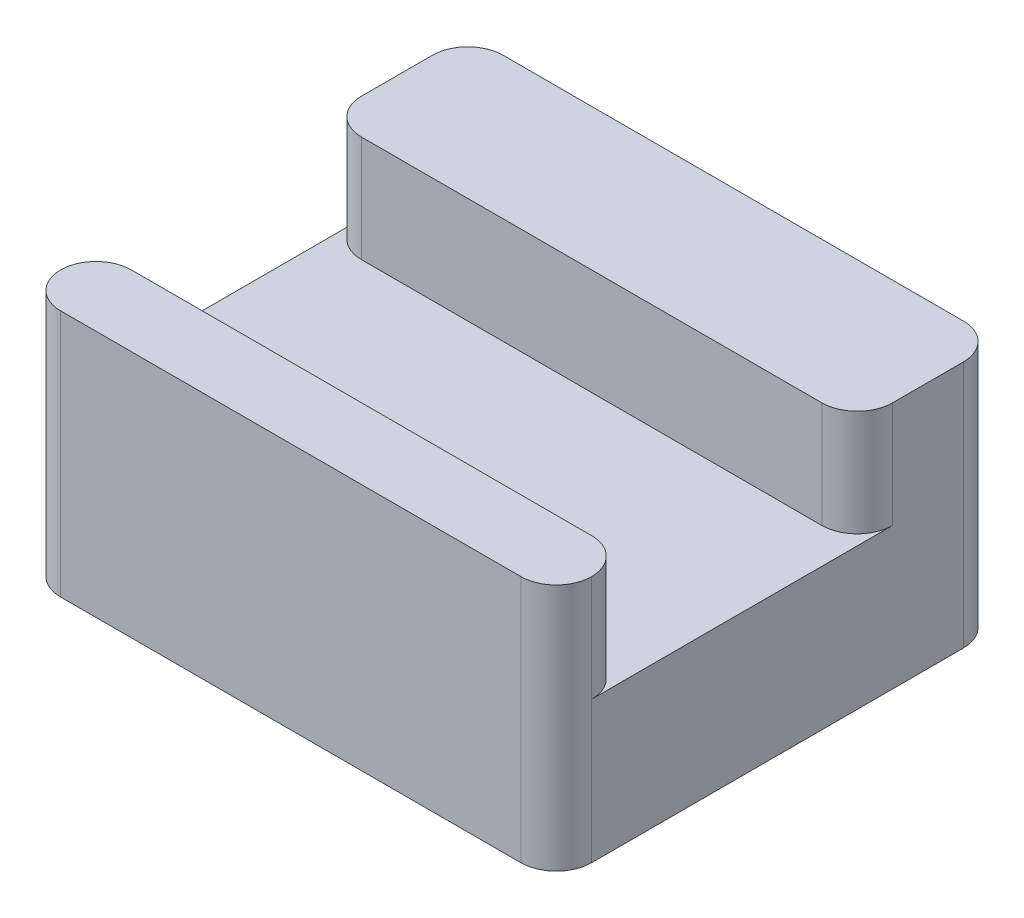
ISO-10303-21;
HEADER;
FILE_DESCRIPTION(('STEP AP214'),'2;1');
FILE_NAME('part.step','',(''),(''),'','','');
FILE_SCHEMA(('AUTOMOTIVE_DESIGN { 1 0 10303 214 1 1 1 1 }'));
ENDSEC;
DATA;
#1=APPLICATION_CONTEXT('core data for automotive mechanical design processes');
#2=APPLICATION_PROTOCOL_DEFINITION('international standard','automotive_design',2000,#1);
#3=PRODUCT_CONTEXT('',#1,'mechanical');
#4=PRODUCT('Part','Part','',(#3));
#5=PRODUCT_RELATED_PRODUCT_CATEGORY('part','',(#4));
#6=PRODUCT_DEFINITION_FORMATION('','',#4);
#7=PRODUCT_DEFINITION_CONTEXT('part definition',#1,'design');
#8=PRODUCT_DEFINITION('design','',#6,#7);
#9=PRODUCT_DEFINITION_SHAPE('','',#8);
#10=(LENGTH_UNIT() NAMED_UNIT(*) SI_UNIT(.MILLI.,.METRE.));
#11=(NAMED_UNIT(*) PLANE_ANGLE_UNIT() SI_UNIT($,.RADIAN.));
#12=(NAMED_UNIT(*) SI_UNIT($,.STERADIAN.) SOLID_ANGLE_UNIT());
#13=UNCERTAINTY_MEASURE_WITH_UNIT(LENGTH_MEASURE(1.E-05),#10,'distance_accuracy_value','');
#14=(GEOMETRIC_REPRESENTATION_CONTEXT(3) GLOBAL_UNCERTAINTY_ASSIGNED_CONTEXT((#13)) GLOBAL_UNIT_ASSIGNED_CONTEXT((#10,
#11,#12)) REPRESENTATION_CONTEXT('',''));
#15=CARTESIAN_POINT('',(0.,0.,0.));
#16=DIRECTION('',(0.,0.,1.));
#17=DIRECTION('',(1.,0.,0.));
#18=AXIS2_PLACEMENT_3D('',#15,#16,#17);
#19=CARTESIAN_POINT('',(0.,7.,0.));
#20=DIRECTION('',(0.,-1.,0.));
#21=DIRECTION('',(0.,0.,-1.));
#22=AXIS2_PLACEMENT_3D('',#19,#20,#21);
#23=PLANE('',#22);
#24=CARTESIAN_POINT('',(-6.5,7.,5.25));
#25=DIRECTION('',(0.,-1.,0.));
#26=DIRECTION('',(0.,0.,-1.));
#27=AXIS2_PLACEMENT_3D('',#24,#25,#26);
#28=CIRCLE('',#27,1.);
#29=CARTESIAN_POINT('',(-6.5,7.,4.25));
#30=VERTEX_POINT('',#29);
#31=CARTESIAN_POINT('',(-7.5,7.,5.25));
#32=VERTEX_POINT('',#31);
#33=EDGE_CURVE('E196',#30,#32,#28,.F.);
#34=ORIENTED_EDGE('',*,*,#33,.T.);
#35=CARTESIAN_POINT('',(-6.5,7.,5.25));
#36=DIRECTION('',(0.,-1.,0.));
#37=DIRECTION('',(0.,0.,-1.));
#38=AXIS2_PLACEMENT_3D('',#35,#36,#37);
#39=CIRCLE('',#38,1.);
#40=CARTESIAN_POINT('',(-6.5,7.,6.25));
#41=VERTEX_POINT('',#40);
#42=EDGE_CURVE('E198',#32,#41,#39,.F.);
#43=ORIENTED_EDGE('',*,*,#42,.T.);
#44=DIRECTION('',(1.,0.,0.));
#45=VECTOR('',#44,1.);
#46=CARTESIAN_POINT('',(-7.5,7.,6.25));
#47=LINE('',#46,#45);
#48=CARTESIAN_POINT('',(6.5,7.,6.25));
#49=VERTEX_POINT('',#48);
#50=EDGE_CURVE('E164',#41,#49,#47,.T.);
#51=ORIENTED_EDGE('',*,*,#50,.T.);
#52=CARTESIAN_POINT('',(6.5,7.,5.25));
#53=DIRECTION('',(0.,-1.,0.));
#54=DIRECTION('',(0.,0.,-1.));
#55=AXIS2_PLACEMENT_3D('',#52,#53,#54);
#56=CIRCLE('',#55,1.);
#57=CARTESIAN_POINT('',(7.5,7.,5.25));
#58=VERTEX_POINT('',#57);
#59=EDGE_CURVE('E192',#49,#58,#56,.F.);
#60=ORIENTED_EDGE('',*,*,#59,.T.);
#61=CARTESIAN_POINT('',(6.5,7.,5.25));
#62=DIRECTION('',(0.,-1.,0.));
#63=DIRECTION('',(0.,0.,-1.));
#64=AXIS2_PLACEMENT_3D('',#61,#62,#63);
#65=CIRCLE('',#64,1.);
#66=CARTESIAN_POINT('',(6.5,7.,4.25));
#67=VERTEX_POINT('',#66);
#68=EDGE_CURVE('E194',#58,#67,#65,.F.);
#69=ORIENTED_EDGE('',*,*,#68,.T.);
#70=DIRECTION('',(1.,0.,0.));
#71=VECTOR('',#70,1.);
#72=CARTESIAN_POINT('',(-7.5,7.,4.25));
#73=LINE('',#72,#71);
#74=EDGE_CURVE('E267',#30,#67,#73,.T.);
#75=ORIENTED_EDGE('',*,*,#74,.F.);
#76=EDGE_LOOP('',(#34,#43,#51,#60,#69,#75));
#77=FACE_BOUND('',#76,.T.);
#78=ADVANCED_FACE('F37',(#77),#23,.F.);
#79=CARTESIAN_POINT('',(7.5,7.,6.25));
#80=DIRECTION('',(-1.,0.,0.));
#81=DIRECTION('',(0.,0.,1.));
#82=AXIS2_PLACEMENT_3D('',#79,#80,#81);
#83=PLANE('',#82);
#84=DIRECTION('',(0.,0.,-1.));
#85=VECTOR('',#84,1.);
#86=CARTESIAN_POINT('',(7.5,0.,6.25));
#87=LINE('',#86,#85);
#88=CARTESIAN_POINT('',(7.5,0.,5.25));
#89=VERTEX_POINT('',#88);
#90=CARTESIAN_POINT('',(7.5,0.,-5.25));
#91=VERTEX_POINT('',#90);
#92=EDGE_CURVE('E251',#89,#91,#87,.T.);
#93=ORIENTED_EDGE('',*,*,#92,.T.);
#94=DIRECTION('',(0.,-1.,0.));
#95=VECTOR('',#94,1.);
#96=CARTESIAN_POINT('',(7.5,7.,-5.25));
#97=LINE('',#96,#95);
#98=CARTESIAN_POINT('',(7.5,7.,-5.25));
#99=VERTEX_POINT('',#98);
#100=EDGE_CURVE('E227',#91,#99,#97,.F.);
#101=ORIENTED_EDGE('',*,*,#100,.T.);
#102=DIRECTION('',(0.,0.,-1.));
#103=VECTOR('',#102,1.);
#104=CARTESIAN_POINT('',(7.5,7.,6.25));
#105=LINE('',#104,#103);
#106=CARTESIAN_POINT('',(7.5,7.,-3.25));
#107=VERTEX_POINT('',#106);
#108=EDGE_CURVE('E171',#107,#99,#105,.T.);
#109=ORIENTED_EDGE('',*,*,#108,.F.);
#110=DIRECTION('',(0.,1.,0.));
#111=VECTOR('',#110,1.);
#112=CARTESIAN_POINT('',(7.5,7.,-3.25));
#113=LINE('',#112,#111);
#114=CARTESIAN_POINT('',(7.5,4.,-3.25));
#115=VERTEX_POINT('',#114);
#116=EDGE_CURVE('E225',#107,#115,#113,.F.);
#117=ORIENTED_EDGE('',*,*,#116,.T.);
#118=DIRECTION('',(0.,0.,-1.));
#119=VECTOR('',#118,1.);
#120=CARTESIAN_POINT('',(7.5,4.,4.25));
#121=LINE('',#120,#119);
#122=CARTESIAN_POINT('',(7.5,4.,5.25));
#123=VERTEX_POINT('',#122);
#124=EDGE_CURVE('E53',#123,#115,#121,.T.);
#125=ORIENTED_EDGE('',*,*,#124,.F.);
#126=DIRECTION('',(0.,-1.,0.));
#127=VECTOR('',#126,1.);
#128=CARTESIAN_POINT('',(7.5,7.,5.25));
#129=LINE('',#128,#127);
#130=EDGE_CURVE('E223',#123,#89,#129,.T.);
#131=ORIENTED_EDGE('',*,*,#130,.T.);
#132=EDGE_LOOP('',(#93,#101,#109,#117,#125,#131));
#133=FACE_BOUND('',#132,.T.);
#134=ADVANCED_FACE('F250',(#133),#83,.F.);
#135=CARTESIAN_POINT('',(-7.5,7.,-6.25));
#136=DIRECTION('',(0.,0.,1.));
#137=DIRECTION('',(1.,0.,0.));
#138=AXIS2_PLACEMENT_3D('',#135,#136,#137);
#139=PLANE('',#138);
#140=CARTESIAN_POINT('',(0.,2.,-6.25));
#141=DIRECTION('',(0.,0.,-1.));
#142=DIRECTION('',(-1.,0.,0.));
#143=AXIS2_PLACEMENT_3D('',#140,#141,#142);
#144=CIRCLE('',#143,1.3);
#145=CARTESIAN_POINT('',(-1.3,2.,-6.25));
#146=VERTEX_POINT('',#145);
#147=EDGE_CURVE('E235',#146,#146,#144,.T.);
#148=ORIENTED_EDGE('',*,*,#147,.F.);
#149=EDGE_LOOP('',(#148));
#150=FACE_BOUND('',#149,.T.);
#151=DIRECTION('',(-1.,0.,0.));
#152=VECTOR('',#151,1.);
#153=CARTESIAN_POINT('',(-7.5,0.,-6.25));
#154=LINE('',#153,#152);
#155=CARTESIAN_POINT('',(6.5,0.,-6.25));
#156=VERTEX_POINT('',#155);
#157=CARTESIAN_POINT('',(-6.5,0.,-6.25));
#158=VERTEX_POINT('',#157);
#159=EDGE_CURVE('E177',#156,#158,#154,.T.);
#160=ORIENTED_EDGE('',*,*,#159,.T.);
#161=DIRECTION('',(0.,-1.,0.));
#162=VECTOR('',#161,1.);
#163=CARTESIAN_POINT('',(-6.5,7.,-6.25));
#164=LINE('',#163,#162);
#165=CARTESIAN_POINT('',(-6.5,7.,-6.25));
#166=VERTEX_POINT('',#165);
#167=EDGE_CURVE('E221',#158,#166,#164,.F.);
#168=ORIENTED_EDGE('',*,*,#167,.T.);
#169=DIRECTION('',(-1.,0.,0.));
#170=VECTOR('',#169,1.);
#171=CARTESIAN_POINT('',(-7.5,7.,-6.25));
#172=LINE('',#171,#170);
#173=CARTESIAN_POINT('',(6.5,7.,-6.25));
#174=VERTEX_POINT('',#173);
#175=EDGE_CURVE('E175',#174,#166,#172,.T.);
#176=ORIENTED_EDGE('',*,*,#175,.F.);
#177=DIRECTION('',(0.,-1.,0.));
#178=VECTOR('',#177,1.);
#179=CARTESIAN_POINT('',(6.5,7.,-6.25));
#180=LINE('',#179,#178);
#181=EDGE_CURVE('E218',#174,#156,#180,.T.);
#182=ORIENTED_EDGE('',*,*,#181,.T.);
#183=EDGE_LOOP('',(#160,#168,#176,#182));
#184=FACE_BOUND('',#183,.T.);
#185=ADVANCED_FACE('F290',(#150,#184),#139,.F.);
#186=CARTESIAN_POINT('',(-7.5,7.,6.25));
#187=DIRECTION('',(1.,0.,0.));
#188=DIRECTION('',(0.,0.,-1.));
#189=AXIS2_PLACEMENT_3D('',#186,#187,#188);
#190=PLANE('',#189);
#191=DIRECTION('',(0.,0.,1.));
#192=VECTOR('',#191,1.);
#193=CARTESIAN_POINT('',(-7.5,0.,6.25));
#194=LINE('',#193,#192);
#195=CARTESIAN_POINT('',(-7.5,0.,-5.25));
#196=VERTEX_POINT('',#195);
#197=CARTESIAN_POINT('',(-7.5,0.,5.25));
#198=VERTEX_POINT('',#197);
#199=EDGE_CURVE('E172',#196,#198,#194,.T.);
#200=ORIENTED_EDGE('',*,*,#199,.T.);
#201=DIRECTION('',(0.,-1.,0.));
#202=VECTOR('',#201,1.);
#203=CARTESIAN_POINT('',(-7.5,7.,5.25));
#204=LINE('',#203,#202);
#205=CARTESIAN_POINT('',(-7.5,4.,5.25));
#206=VERTEX_POINT('',#205);
#207=EDGE_CURVE('E149',#198,#206,#204,.F.);
#208=ORIENTED_EDGE('',*,*,#207,.T.);
#209=DIRECTION('',(0.,0.,1.));
#210=VECTOR('',#209,1.);
#211=CARTESIAN_POINT('',(-7.5,4.,4.25));
#212=LINE('',#211,#210);
#213=CARTESIAN_POINT('',(-7.5,4.,-3.25));
#214=VERTEX_POINT('',#213);
#215=EDGE_CURVE('E258',#214,#206,#212,.T.);
#216=ORIENTED_EDGE('',*,*,#215,.F.);
#217=DIRECTION('',(0.,1.,0.));
#218=VECTOR('',#217,1.);
#219=CARTESIAN_POINT('',(-7.5,7.,-3.25));
#220=LINE('',#219,#218);
#221=CARTESIAN_POINT('',(-7.5,7.,-3.25));
#222=VERTEX_POINT('',#221);
#223=EDGE_CURVE('E188',#214,#222,#220,.T.);
#224=ORIENTED_EDGE('',*,*,#223,.T.);
#225=DIRECTION('',(0.,0.,1.));
#226=VECTOR('',#225,1.);
#227=CARTESIAN_POINT('',(-7.5,7.,6.25));
#228=LINE('',#227,#226);
#229=CARTESIAN_POINT('',(-7.5,7.,-5.25));
#230=VERTEX_POINT('',#229);
#231=EDGE_CURVE('E262',#230,#222,#228,.T.);
#232=ORIENTED_EDGE('',*,*,#231,.F.);
#233=DIRECTION('',(0.,-1.,0.));
#234=VECTOR('',#233,1.);
#235=CARTESIAN_POINT('',(-7.5,7.,-5.25));
#236=LINE('',#235,#234);
#237=EDGE_CURVE('E154',#230,#196,#236,.T.);
#238=ORIENTED_EDGE('',*,*,#237,.T.);
#239=EDGE_LOOP('',(#200,#208,#216,#224,#232,#238));
#240=FACE_BOUND('',#239,.T.);
#241=ADVANCED_FACE('F293',(#240),#190,.F.);
#242=CARTESIAN_POINT('',(-7.5,7.,6.25));
#243=DIRECTION('',(0.,0.,-1.));
#244=DIRECTION('',(-1.,0.,0.));
#245=AXIS2_PLACEMENT_3D('',#242,#243,#244);
#246=PLANE('',#245);
#247=ORIENTED_EDGE('',*,*,#50,.F.);
#248=DIRECTION('',(0.,-1.,0.));
#249=VECTOR('',#248,1.);
#250=CARTESIAN_POINT('',(-6.5,7.,6.25));
#251=LINE('',#250,#249);
#252=CARTESIAN_POINT('',(-6.5,0.,6.25));
#253=VERTEX_POINT('',#252);
#254=EDGE_CURVE('E147',#41,#253,#251,.T.);
#255=ORIENTED_EDGE('',*,*,#254,.T.);
#256=DIRECTION('',(1.,0.,0.));
#257=VECTOR('',#256,1.);
#258=CARTESIAN_POINT('',(-7.5,0.,6.25));
#259=LINE('',#258,#257);
#260=CARTESIAN_POINT('',(6.5,0.,6.25));
#261=VERTEX_POINT('',#260);
#262=EDGE_CURVE('E161',#253,#261,#259,.T.);
#263=ORIENTED_EDGE('',*,*,#262,.T.);
#264=DIRECTION('',(0.,-1.,0.));
#265=VECTOR('',#264,1.);
#266=CARTESIAN_POINT('',(6.5,7.,6.25));
#267=LINE('',#266,#265);
#268=EDGE_CURVE('E166',#261,#49,#267,.F.);
#269=ORIENTED_EDGE('',*,*,#268,.T.);
#270=EDGE_LOOP('',(#247,#255,#263,#269));
#271=FACE_BOUND('',#270,.T.);
#272=ADVANCED_FACE('F160',(#271),#246,.F.);
#273=ORIENTED_EDGE('',*,*,#231,.T.);
#274=CARTESIAN_POINT('',(-6.5,7.,-3.25));
#275=DIRECTION('',(0.,-1.,0.));
#276=DIRECTION('',(0.,0.,-1.));
#277=AXIS2_PLACEMENT_3D('',#274,#275,#276);
#278=CIRCLE('',#277,1.);
#279=CARTESIAN_POINT('',(-6.5,7.,-2.25));
#280=VERTEX_POINT('',#279);
#281=EDGE_CURVE('E211',#222,#280,#278,.F.);
#282=ORIENTED_EDGE('',*,*,#281,.T.);
#283=DIRECTION('',(-1.,0.,0.));
#284=VECTOR('',#283,1.);
#285=CARTESIAN_POINT('',(-7.5,7.,-2.25));
#286=LINE('',#285,#284);
#287=CARTESIAN_POINT('',(6.5,7.,-2.25));
#288=VERTEX_POINT('',#287);
#289=EDGE_CURVE('E270',#288,#280,#286,.T.);
#290=ORIENTED_EDGE('',*,*,#289,.F.);
#291=CARTESIAN_POINT('',(6.5,7.,-3.25));
#292=DIRECTION('',(0.,-1.,0.));
#293=DIRECTION('',(0.,0.,-1.));
#294=AXIS2_PLACEMENT_3D('',#291,#292,#293);
#295=CIRCLE('',#294,1.);
#296=EDGE_CURVE('E205',#288,#107,#295,.F.);
#297=ORIENTED_EDGE('',*,*,#296,.T.);
#298=ORIENTED_EDGE('',*,*,#108,.T.);
#299=CARTESIAN_POINT('',(6.5,7.,-5.25));
#300=DIRECTION('',(0.,-1.,0.));
#301=DIRECTION('',(0.,0.,-1.));
#302=AXIS2_PLACEMENT_3D('',#299,#300,#301);
#303=CIRCLE('',#302,1.);
#304=EDGE_CURVE('E207',#99,#174,#303,.F.);
#305=ORIENTED_EDGE('',*,*,#304,.T.);
#306=ORIENTED_EDGE('',*,*,#175,.T.);
#307=CARTESIAN_POINT('',(-6.5,7.,-5.25));
#308=DIRECTION('',(0.,-1.,0.));
#309=DIRECTION('',(0.,0.,-1.));
#310=AXIS2_PLACEMENT_3D('',#307,#308,#309);
#311=CIRCLE('',#310,1.);
#312=EDGE_CURVE('E209',#166,#230,#311,.F.);
#313=ORIENTED_EDGE('',*,*,#312,.T.);
#314=EDGE_LOOP('',(#273,#282,#290,#297,#298,#305,#306,#313));
#315=FACE_BOUND('',#314,.T.);
#316=ADVANCED_FACE('F304',(#315),#23,.F.);
#317=CARTESIAN_POINT('',(0.,0.,0.));
#318=DIRECTION('',(0.,-1.,0.));
#319=DIRECTION('',(0.,0.,-1.));
#320=AXIS2_PLACEMENT_3D('',#317,#318,#319);
#321=PLANE('',#320);
#322=ORIENTED_EDGE('',*,*,#262,.F.);
#323=CARTESIAN_POINT('',(-6.5,0.,5.25));
#324=DIRECTION('',(0.,-1.,0.));
#325=DIRECTION('',(0.,0.,-1.));
#326=AXIS2_PLACEMENT_3D('',#323,#324,#325);
#327=CIRCLE('',#326,1.);
#328=EDGE_CURVE('E142',#253,#198,#327,.T.);
#329=ORIENTED_EDGE('',*,*,#328,.T.);
#330=ORIENTED_EDGE('',*,*,#199,.F.);
#331=CARTESIAN_POINT('',(-6.5,0.,-5.25));
#332=DIRECTION('',(0.,-1.,0.));
#333=DIRECTION('',(0.,0.,-1.));
#334=AXIS2_PLACEMENT_3D('',#331,#332,#333);
#335=CIRCLE('',#334,1.);
#336=EDGE_CURVE('E155',#196,#158,#335,.T.);
#337=ORIENTED_EDGE('',*,*,#336,.T.);
#338=ORIENTED_EDGE('',*,*,#159,.F.);
#339=CARTESIAN_POINT('',(6.5,0.,-5.25));
#340=DIRECTION('',(0.,-1.,0.));
#341=DIRECTION('',(0.,0.,-1.));
#342=AXIS2_PLACEMENT_3D('',#339,#340,#341);
#343=CIRCLE('',#342,1.);
#344=EDGE_CURVE('E183',#156,#91,#343,.T.);
#345=ORIENTED_EDGE('',*,*,#344,.T.);
#346=ORIENTED_EDGE('',*,*,#92,.F.);
#347=CARTESIAN_POINT('',(6.5,0.,5.25));
#348=DIRECTION('',(0.,-1.,0.));
#349=DIRECTION('',(0.,0.,-1.));
#350=AXIS2_PLACEMENT_3D('',#347,#348,#349);
#351=CIRCLE('',#350,1.);
#352=EDGE_CURVE('E165',#89,#261,#351,.T.);
#353=ORIENTED_EDGE('',*,*,#352,.T.);
#354=EDGE_LOOP('',(#322,#329,#330,#337,#338,#345,#346,#353));
#355=FACE_BOUND('',#354,.T.);
#356=ADVANCED_FACE('F168',(#355),#321,.T.);
#357=CARTESIAN_POINT('',(-7.5,4.,4.25));
#358=DIRECTION('',(0.,0.,1.));
#359=DIRECTION('',(1.,0.,0.));
#360=AXIS2_PLACEMENT_3D('',#357,#358,#359);
#361=PLANE('',#360);
#362=DIRECTION('',(1.,0.,0.));
#363=VECTOR('',#362,1.);
#364=CARTESIAN_POINT('',(-7.5,4.,4.25));
#365=LINE('',#364,#363);
#366=CARTESIAN_POINT('',(-6.5,4.,4.25));
#367=VERTEX_POINT('',#366);
#368=CARTESIAN_POINT('',(6.5,4.,4.25));
#369=VERTEX_POINT('',#368);
#370=EDGE_CURVE('E254',#367,#369,#365,.T.);
#371=ORIENTED_EDGE('',*,*,#370,.F.);
#372=DIRECTION('',(0.,1.,0.));
#373=VECTOR('',#372,1.);
#374=CARTESIAN_POINT('',(-6.5,4.,4.25));
#375=LINE('',#374,#373);
#376=EDGE_CURVE('E203',#367,#30,#375,.T.);
#377=ORIENTED_EDGE('',*,*,#376,.T.);
#378=ORIENTED_EDGE('',*,*,#74,.T.);
#379=DIRECTION('',(0.,1.,0.));
#380=VECTOR('',#379,1.);
#381=CARTESIAN_POINT('',(6.5,4.,4.25));
#382=LINE('',#381,#380);
#383=EDGE_CURVE('E200',#67,#369,#382,.F.);
#384=ORIENTED_EDGE('',*,*,#383,.T.);
#385=EDGE_LOOP('',(#371,#377,#378,#384));
#386=FACE_BOUND('',#385,.T.);
#387=ADVANCED_FACE('F346',(#386),#361,.F.);
#388=CARTESIAN_POINT('',(-7.5,4.,-2.25));
#389=DIRECTION('',(0.,0.,-1.));
#390=DIRECTION('',(-1.,0.,0.));
#391=AXIS2_PLACEMENT_3D('',#388,#389,#390);
#392=PLANE('',#391);
#393=ORIENTED_EDGE('',*,*,#289,.T.);
#394=DIRECTION('',(0.,1.,0.));
#395=VECTOR('',#394,1.);
#396=CARTESIAN_POINT('',(-6.5,4.,-2.25));
#397=LINE('',#396,#395);
#398=CARTESIAN_POINT('',(-6.5,4.,-2.25));
#399=VERTEX_POINT('',#398);
#400=EDGE_CURVE('E216',#280,#399,#397,.F.);
#401=ORIENTED_EDGE('',*,*,#400,.T.);
#402=DIRECTION('',(-1.,0.,0.));
#403=VECTOR('',#402,1.);
#404=CARTESIAN_POINT('',(-7.5,4.,-2.25));
#405=LINE('',#404,#403);
#406=CARTESIAN_POINT('',(6.5,4.,-2.25));
#407=VERTEX_POINT('',#406);
#408=EDGE_CURVE('E274',#407,#399,#405,.T.);
#409=ORIENTED_EDGE('',*,*,#408,.F.);
#410=DIRECTION('',(0.,1.,0.));
#411=VECTOR('',#410,1.);
#412=CARTESIAN_POINT('',(6.5,4.,-2.25));
#413=LINE('',#412,#411);
#414=EDGE_CURVE('E213',#407,#288,#413,.T.);
#415=ORIENTED_EDGE('',*,*,#414,.T.);
#416=EDGE_LOOP('',(#393,#401,#409,#415));
#417=FACE_BOUND('',#416,.T.);
#418=ADVANCED_FACE('F313',(#417),#392,.F.);
#419=CARTESIAN_POINT('',(0.,4.,0.));
#420=DIRECTION('',(0.,-1.,0.));
#421=DIRECTION('',(0.,0.,-1.));
#422=AXIS2_PLACEMENT_3D('',#419,#420,#421);
#423=PLANE('',#422);
#424=ORIENTED_EDGE('',*,*,#124,.T.);
#425=CARTESIAN_POINT('',(6.5,4.,-3.25));
#426=DIRECTION('',(0.,-1.,0.));
#427=DIRECTION('',(0.,0.,-1.));
#428=AXIS2_PLACEMENT_3D('',#425,#426,#427);
#429=CIRCLE('',#428,1.);
#430=EDGE_CURVE('E46',#115,#407,#429,.T.);
#431=ORIENTED_EDGE('',*,*,#430,.T.);
#432=ORIENTED_EDGE('',*,*,#408,.T.);
#433=CARTESIAN_POINT('',(-6.5,4.,-3.25));
#434=DIRECTION('',(0.,-1.,0.));
#435=DIRECTION('',(0.,0.,-1.));
#436=AXIS2_PLACEMENT_3D('',#433,#434,#435);
#437=CIRCLE('',#436,1.);
#438=EDGE_CURVE('E231',#399,#214,#437,.T.);
#439=ORIENTED_EDGE('',*,*,#438,.T.);
#440=ORIENTED_EDGE('',*,*,#215,.T.);
#441=CARTESIAN_POINT('',(-6.5,4.,5.25));
#442=DIRECTION('',(0.,-1.,0.));
#443=DIRECTION('',(0.,0.,-1.));
#444=AXIS2_PLACEMENT_3D('',#441,#442,#443);
#445=CIRCLE('',#444,1.);
#446=EDGE_CURVE('E229',#206,#367,#445,.T.);
#447=ORIENTED_EDGE('',*,*,#446,.T.);
#448=ORIENTED_EDGE('',*,*,#370,.T.);
#449=CARTESIAN_POINT('',(6.5,4.,5.25));
#450=DIRECTION('',(0.,-1.,0.));
#451=DIRECTION('',(0.,0.,-1.));
#452=AXIS2_PLACEMENT_3D('',#449,#450,#451);
#453=CIRCLE('',#452,1.);
#454=EDGE_CURVE('E11',#369,#123,#453,.T.);
#455=ORIENTED_EDGE('',*,*,#454,.T.);
#456=EDGE_LOOP('',(#424,#431,#432,#439,#440,#447,#448,#455));
#457=FACE_BOUND('',#456,.T.);
#458=ADVANCED_FACE('F286',(#457),#423,.F.);
#459=CARTESIAN_POINT('',(0.,2.,4.25));
#460=DIRECTION('',(0.,0.,-1.));
#461=DIRECTION('',(-1.,0.,0.));
#462=AXIS2_PLACEMENT_3D('',#459,#460,#461);
#463=CYLINDRICAL_SURFACE('',#462,1.3);
#464=CARTESIAN_POINT('',(0.,2.,4.25));
#465=DIRECTION('',(0.,0.,-1.));
#466=DIRECTION('',(-1.,0.,0.));
#467=AXIS2_PLACEMENT_3D('',#464,#465,#466);
#468=CIRCLE('',#467,1.3);
#469=CARTESIAN_POINT('',(-1.3,2.,4.25));
#470=VERTEX_POINT('',#469);
#471=EDGE_CURVE('E238',#470,#470,#468,.T.);
#472=CARTESIAN_POINT('',(-1.3,2.,4.25));
#473=CARTESIAN_POINT('',(-1.3,2.,4.140625));
#474=CARTESIAN_POINT('',(-1.3,2.,4.03125));
#475=CARTESIAN_POINT('',(-1.3,2.,3.8125));
#476=CARTESIAN_POINT('',(-1.3,2.,3.703125));
#477=CARTESIAN_POINT('',(-1.3,2.,3.484375));
#478=CARTESIAN_POINT('',(-1.3,2.,3.375));
#479=CARTESIAN_POINT('',(-1.3,2.,3.15625));
#480=CARTESIAN_POINT('',(-1.3,2.,3.046875));
#481=CARTESIAN_POINT('',(-1.3,2.,2.828125));
#482=CARTESIAN_POINT('',(-1.3,2.,2.71875));
#483=CARTESIAN_POINT('',(-1.3,2.,2.5));
#484=CARTESIAN_POINT('',(-1.3,2.,2.390625));
#485=CARTESIAN_POINT('',(-1.3,2.,2.171875));
#486=CARTESIAN_POINT('',(-1.3,2.,2.0625));
#487=CARTESIAN_POINT('',(-1.3,2.,1.84375));
#488=CARTESIAN_POINT('',(-1.3,2.,1.734375));
#489=CARTESIAN_POINT('',(-1.3,2.,1.515625));
#490=CARTESIAN_POINT('',(-1.3,2.,1.40625));
#491=CARTESIAN_POINT('',(-1.3,2.,1.1875));
#492=CARTESIAN_POINT('',(-1.3,2.,1.078125));
#493=CARTESIAN_POINT('',(-1.3,2.,0.859375));
#494=CARTESIAN_POINT('',(-1.3,2.,0.75));
#495=CARTESIAN_POINT('',(-1.3,2.,0.53125));
#496=CARTESIAN_POINT('',(-1.3,2.,0.421875));
#497=CARTESIAN_POINT('',(-1.3,2.,0.203125));
#498=CARTESIAN_POINT('',(-1.3,2.,0.0937500000000001));
#499=CARTESIAN_POINT('',(-1.3,2.,-0.125));
#500=CARTESIAN_POINT('',(-1.3,2.,-0.234375));
#501=CARTESIAN_POINT('',(-1.3,2.,-0.453125));
#502=CARTESIAN_POINT('',(-1.3,2.,-0.5625));
#503=CARTESIAN_POINT('',(-1.3,2.,-0.78125));
#504=CARTESIAN_POINT('',(-1.3,2.,-0.890625));
#505=CARTESIAN_POINT('',(-1.3,2.,-1.109375));
#506=CARTESIAN_POINT('',(-1.3,2.,-1.21875));
#507=CARTESIAN_POINT('',(-1.3,2.,-1.4375));
#508=CARTESIAN_POINT('',(-1.3,2.,-1.546875));
#509=CARTESIAN_POINT('',(-1.3,2.,-1.765625));
#510=CARTESIAN_POINT('',(-1.3,2.,-1.875));
#511=CARTESIAN_POINT('',(-1.3,2.,-2.09375));
#512=CARTESIAN_POINT('',(-1.3,2.,-2.203125));
#513=CARTESIAN_POINT('',(-1.3,2.,-2.421875));
#514=CARTESIAN_POINT('',(-1.3,2.,-2.53125));
#515=CARTESIAN_POINT('',(-1.3,2.,-2.75));
#516=CARTESIAN_POINT('',(-1.3,2.,-2.859375));
#517=CARTESIAN_POINT('',(-1.3,2.,-3.078125));
#518=CARTESIAN_POINT('',(-1.3,2.,-3.1875));
#519=CARTESIAN_POINT('',(-1.3,2.,-3.40625));
#520=CARTESIAN_POINT('',(-1.3,2.,-3.515625));
#521=CARTESIAN_POINT('',(-1.3,2.,-3.734375));
#522=CARTESIAN_POINT('',(-1.3,2.,-3.84375));
#523=CARTESIAN_POINT('',(-1.3,2.,-4.0625));
#524=CARTESIAN_POINT('',(-1.3,2.,-4.171875));
#525=CARTESIAN_POINT('',(-1.3,2.,-4.390625));
#526=CARTESIAN_POINT('',(-1.3,2.,-4.5));
#527=CARTESIAN_POINT('',(-1.3,2.,-4.71875));
#528=CARTESIAN_POINT('',(-1.3,2.,-4.828125));
#529=CARTESIAN_POINT('',(-1.3,2.,-5.046875));
#530=CARTESIAN_POINT('',(-1.3,2.,-5.15625));
#531=CARTESIAN_POINT('',(-1.3,2.,-5.375));
#532=CARTESIAN_POINT('',(-1.3,2.,-5.484375));
#533=CARTESIAN_POINT('',(-1.3,2.,-5.703125));
#534=CARTESIAN_POINT('',(-1.3,2.,-5.8125));
#535=CARTESIAN_POINT('',(-1.3,2.,-6.03125));
#536=CARTESIAN_POINT('',(-1.3,2.,-6.140625));
#537=CARTESIAN_POINT('',(-1.3,2.,-6.25));
#538=B_SPLINE_CURVE_WITH_KNOTS('',3,(#472,#473,#474,#475,#476,#477,#478,#479,#480,#481,#482,
#483,#484,#485,#486,#487,#488,#489,#490,#491,#492,#493,#494,#495,#496,#497,#498,#499,#500,#501,
#502,#503,#504,#505,#506,#507,#508,#509,#510,#511,#512,#513,#514,#515,#516,#517,#518,#519,#520,
#521,#522,#523,#524,#525,#526,#527,#528,#529,#530,#531,#532,#533,#534,#535,#536,#537),
.UNSPECIFIED.,.F.,.F.,(4,2,2,2,2,2,2,2,2,2,2,2,2,2,2,2,2,2,2,2,2,2,2,2,2,2,2,2,2,2,2,2,4),(0.,
0.328125,0.656250000000001,0.984375,1.3125,1.640625,1.96875,2.296875,2.625,2.953125,3.28125,
3.609375,3.9375,4.265625,4.59375,4.921875,5.25,5.578125,5.90625,6.234375,6.5625,6.890625,
7.21875,7.546875,7.875,8.203125,8.53125,8.859375,9.1875,9.515625,9.84375,10.171875,10.5),.UNSPECIFIED.);
#539=EDGE_CURVE('BSEAM283',#470,#146,#538,.T.);
#540=ORIENTED_EDGE('',*,*,#471,.F.);
#541=ORIENTED_EDGE('',*,*,#147,.T.);
#542=ORIENTED_EDGE('',*,*,#539,.T.);
#543=ORIENTED_EDGE('',*,*,#539,.F.);
#544=EDGE_LOOP('',(#540,#542,#541,#543));
#545=FACE_BOUND('',#544,.T.);
#546=ADVANCED_FACE('F283',(#545),#463,.F.);
#547=CARTESIAN_POINT('',(0.,2.,4.25));
#548=DIRECTION('',(0.,0.,-1.));
#549=DIRECTION('',(-1.,0.,0.));
#550=AXIS2_PLACEMENT_3D('',#547,#548,#549);
#551=PLANE('',#550);
#552=ORIENTED_EDGE('',*,*,#471,.T.);
#553=EDGE_LOOP('',(#552));
#554=FACE_BOUND('',#553,.T.);
#555=ADVANCED_FACE('F281',(#554),#551,.T.);
#556=CARTESIAN_POINT('',(-6.5,4.,5.25));
#557=DIRECTION('',(0.,1.,0.));
#558=DIRECTION('',(0.,0.,1.));
#559=AXIS2_PLACEMENT_3D('',#556,#557,#558);
#560=CYLINDRICAL_SURFACE('',#559,1.);
#561=ORIENTED_EDGE('',*,*,#376,.F.);
#562=ORIENTED_EDGE('',*,*,#446,.F.);
#563=DIRECTION('',(0.,1.,0.));
#564=VECTOR('',#563,1.);
#565=CARTESIAN_POINT('',(-7.5,7.,5.25));
#566=LINE('',#565,#564);
#567=EDGE_CURVE('E234',#32,#206,#566,.F.);
#568=ORIENTED_EDGE('',*,*,#567,.F.);
#569=ORIENTED_EDGE('',*,*,#33,.F.);
#570=EDGE_LOOP('',(#561,#562,#568,#569));
#571=FACE_BOUND('',#570,.T.);
#572=ADVANCED_FACE('F355',(#571),#560,.T.);
#573=CARTESIAN_POINT('',(-6.5,7.,5.25));
#574=DIRECTION('',(0.,-1.,0.));
#575=DIRECTION('',(0.,0.,-1.));
#576=AXIS2_PLACEMENT_3D('',#573,#574,#575);
#577=CYLINDRICAL_SURFACE('',#576,1.);
#578=ORIENTED_EDGE('',*,*,#567,.T.);
#579=ORIENTED_EDGE('',*,*,#207,.F.);
#580=ORIENTED_EDGE('',*,*,#328,.F.);
#581=ORIENTED_EDGE('',*,*,#254,.F.);
#582=ORIENTED_EDGE('',*,*,#42,.F.);
#583=EDGE_LOOP('',(#578,#579,#580,#581,#582));
#584=FACE_BOUND('',#583,.T.);
#585=ADVANCED_FACE('F145',(#584),#577,.T.);
#586=CARTESIAN_POINT('',(-6.5,7.,-3.25));
#587=DIRECTION('',(0.,1.,0.));
#588=DIRECTION('',(0.,0.,1.));
#589=AXIS2_PLACEMENT_3D('',#586,#587,#588);
#590=CYLINDRICAL_SURFACE('',#589,1.);
#591=ORIENTED_EDGE('',*,*,#438,.F.);
#592=ORIENTED_EDGE('',*,*,#400,.F.);
#593=ORIENTED_EDGE('',*,*,#281,.F.);
#594=ORIENTED_EDGE('',*,*,#223,.F.);
#595=EDGE_LOOP('',(#591,#592,#593,#594));
#596=FACE_BOUND('',#595,.T.);
#597=ADVANCED_FACE('F309',(#596),#590,.T.);
#598=CARTESIAN_POINT('',(-6.5,7.,-5.25));
#599=DIRECTION('',(0.,-1.,0.));
#600=DIRECTION('',(0.,0.,-1.));
#601=AXIS2_PLACEMENT_3D('',#598,#599,#600);
#602=CYLINDRICAL_SURFACE('',#601,1.);
#603=ORIENTED_EDGE('',*,*,#312,.F.);
#604=ORIENTED_EDGE('',*,*,#167,.F.);
#605=ORIENTED_EDGE('',*,*,#336,.F.);
#606=ORIENTED_EDGE('',*,*,#237,.F.);
#607=EDGE_LOOP('',(#603,#604,#605,#606));
#608=FACE_BOUND('',#607,.T.);
#609=ADVANCED_FACE('F300',(#608),#602,.T.);
#610=CARTESIAN_POINT('',(6.5,7.,-5.25));
#611=DIRECTION('',(0.,-1.,0.));
#612=DIRECTION('',(0.,0.,-1.));
#613=AXIS2_PLACEMENT_3D('',#610,#611,#612);
#614=CYLINDRICAL_SURFACE('',#613,1.);
#615=ORIENTED_EDGE('',*,*,#304,.F.);
#616=ORIENTED_EDGE('',*,*,#100,.F.);
#617=ORIENTED_EDGE('',*,*,#344,.F.);
#618=ORIENTED_EDGE('',*,*,#181,.F.);
#619=EDGE_LOOP('',(#615,#616,#617,#618));
#620=FACE_BOUND('',#619,.T.);
#621=ADVANCED_FACE('F323',(#620),#614,.T.);
#622=CARTESIAN_POINT('',(6.5,4.,-3.25));
#623=DIRECTION('',(0.,1.,0.));
#624=DIRECTION('',(0.,0.,1.));
#625=AXIS2_PLACEMENT_3D('',#622,#623,#624);
#626=CYLINDRICAL_SURFACE('',#625,1.);
#627=ORIENTED_EDGE('',*,*,#430,.F.);
#628=ORIENTED_EDGE('',*,*,#116,.F.);
#629=ORIENTED_EDGE('',*,*,#296,.F.);
#630=ORIENTED_EDGE('',*,*,#414,.F.);
#631=EDGE_LOOP('',(#627,#628,#629,#630));
#632=FACE_BOUND('',#631,.T.);
#633=ADVANCED_FACE('F318',(#632),#626,.T.);
#634=CARTESIAN_POINT('',(6.5,7.,5.25));
#635=DIRECTION('',(0.,-1.,0.));
#636=DIRECTION('',(0.,0.,-1.));
#637=AXIS2_PLACEMENT_3D('',#634,#635,#636);
#638=CYLINDRICAL_SURFACE('',#637,1.);
#639=ORIENTED_EDGE('',*,*,#352,.F.);
#640=ORIENTED_EDGE('',*,*,#130,.F.);
#641=DIRECTION('',(0.,-1.,0.));
#642=VECTOR('',#641,1.);
#643=CARTESIAN_POINT('',(7.5,7.,5.25));
#644=LINE('',#643,#642);
#645=EDGE_CURVE('E41',#58,#123,#644,.T.);
#646=ORIENTED_EDGE('',*,*,#645,.F.);
#647=ORIENTED_EDGE('',*,*,#59,.F.);
#648=ORIENTED_EDGE('',*,*,#268,.F.);
#649=EDGE_LOOP('',(#639,#640,#646,#647,#648));
#650=FACE_BOUND('',#649,.T.);
#651=ADVANCED_FACE('F39',(#650),#638,.T.);
#652=CARTESIAN_POINT('',(6.5,7.,5.25));
#653=DIRECTION('',(0.,1.,0.));
#654=DIRECTION('',(0.,0.,1.));
#655=AXIS2_PLACEMENT_3D('',#652,#653,#654);
#656=CYLINDRICAL_SURFACE('',#655,1.);
#657=ORIENTED_EDGE('',*,*,#454,.F.);
#658=ORIENTED_EDGE('',*,*,#383,.F.);
#659=ORIENTED_EDGE('',*,*,#68,.F.);
#660=ORIENTED_EDGE('',*,*,#645,.T.);
#661=EDGE_LOOP('',(#657,#658,#659,#660));
#662=FACE_BOUND('',#661,.T.);
#663=ADVANCED_FACE('F244',(#662),#656,.T.);
#664=CLOSED_SHELL('',(#78,#134,#185,#241,#272,#316,#356,#387,#418,#458,#546,#555,#572,#585,#597,
#609,#621,#633,#651,#663));
#665=MANIFOLD_SOLID_BREP('B2',#664);
#666=ADVANCED_BREP_SHAPE_REPRESENTATION('',(#18,#665),#14);
#667=SHAPE_DEFINITION_REPRESENTATION(#9,#666);
ENDSEC;
END-ISO-10303-21;
